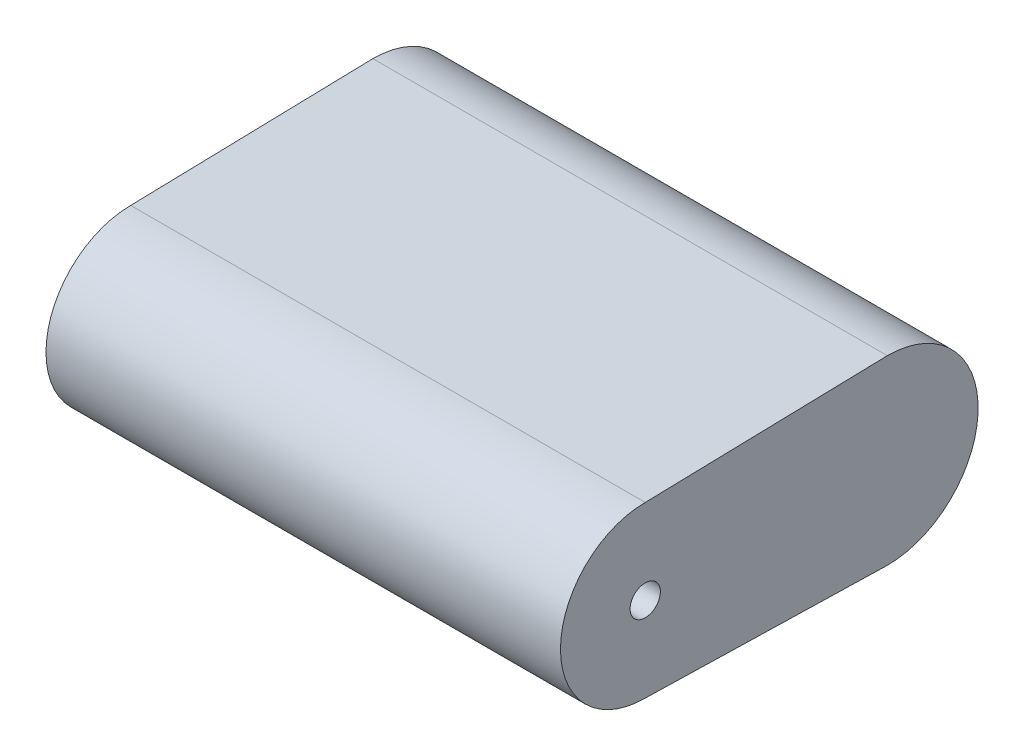
ISO-10303-21;
HEADER;
FILE_DESCRIPTION(('STEP AP214'),'2;1');
FILE_NAME('part.step','',(''),(''),'','','');
FILE_SCHEMA(('AUTOMOTIVE_DESIGN { 1 0 10303 214 1 1 1 1 }'));
ENDSEC;
DATA;
#1=APPLICATION_CONTEXT('core data for automotive mechanical design processes');
#2=APPLICATION_PROTOCOL_DEFINITION('international standard','automotive_design',2000,#1);
#3=PRODUCT_CONTEXT('',#1,'mechanical');
#4=PRODUCT('Part','Part','',(#3));
#5=PRODUCT_RELATED_PRODUCT_CATEGORY('part','',(#4));
#6=PRODUCT_DEFINITION_FORMATION('','',#4);
#7=PRODUCT_DEFINITION_CONTEXT('part definition',#1,'design');
#8=PRODUCT_DEFINITION('design','',#6,#7);
#9=PRODUCT_DEFINITION_SHAPE('','',#8);
#10=(LENGTH_UNIT() NAMED_UNIT(*) SI_UNIT(.MILLI.,.METRE.));
#11=(NAMED_UNIT(*) PLANE_ANGLE_UNIT() SI_UNIT($,.RADIAN.));
#12=(NAMED_UNIT(*) SI_UNIT($,.STERADIAN.) SOLID_ANGLE_UNIT());
#13=UNCERTAINTY_MEASURE_WITH_UNIT(LENGTH_MEASURE(1.E-05),#10,'distance_accuracy_value','');
#14=(GEOMETRIC_REPRESENTATION_CONTEXT(3) GLOBAL_UNCERTAINTY_ASSIGNED_CONTEXT((#13)) GLOBAL_UNIT_ASSIGNED_CONTEXT((#10,
#11,#12)) REPRESENTATION_CONTEXT('',''));
#15=CARTESIAN_POINT('',(0.,0.,0.));
#16=DIRECTION('',(0.,0.,1.));
#17=DIRECTION('',(1.,0.,0.));
#18=AXIS2_PLACEMENT_3D('',#15,#16,#17);
#19=CARTESIAN_POINT('',(42.5,0.,0.));
#20=DIRECTION('',(1.,0.,0.));
#21=DIRECTION('',(0.,0.,-1.));
#22=AXIS2_PLACEMENT_3D('',#19,#20,#21);
#23=PLANE('',#22);
#24=CARTESIAN_POINT('',(42.5,0.,0.));
#25=DIRECTION('',(1.,0.,0.));
#26=DIRECTION('',(0.,0.,-1.));
#27=AXIS2_PLACEMENT_3D('',#24,#25,#26);
#28=CIRCLE('',#27,14.);
#29=CARTESIAN_POINT('',(42.5,14.,0.));
#30=VERTEX_POINT('',#29);
#31=CARTESIAN_POINT('',(42.5,-14.,0.));
#32=VERTEX_POINT('',#31);
#33=EDGE_CURVE('E85',#30,#32,#28,.T.);
#34=ORIENTED_EDGE('',*,*,#33,.T.);
#35=DIRECTION('',(0.,-0.024992191160203,-0.999687646408123));
#36=VECTOR('',#35,1.);
#37=CARTESIAN_POINT('',(42.5,-14.,0.));
#38=LINE('',#37,#36);
#39=CARTESIAN_POINT('',(42.5,-15.,-40.));
#40=VERTEX_POINT('',#39);
#41=EDGE_CURVE('E80',#32,#40,#38,.T.);
#42=ORIENTED_EDGE('',*,*,#41,.T.);
#43=CARTESIAN_POINT('',(42.5,0.,-40.));
#44=DIRECTION('',(1.,0.,0.));
#45=DIRECTION('',(0.,0.,-1.));
#46=AXIS2_PLACEMENT_3D('',#43,#44,#45);
#47=CIRCLE('',#46,15.);
#48=CARTESIAN_POINT('',(42.5,15.,-40.));
#49=VERTEX_POINT('',#48);
#50=EDGE_CURVE('E83',#40,#49,#47,.T.);
#51=ORIENTED_EDGE('',*,*,#50,.T.);
#52=DIRECTION('',(0.,-0.024992191160203,0.999687646408123));
#53=VECTOR('',#52,1.);
#54=CARTESIAN_POINT('',(42.5,14.,0.));
#55=LINE('',#54,#53);
#56=EDGE_CURVE('E50',#49,#30,#55,.T.);
#57=ORIENTED_EDGE('',*,*,#56,.T.);
#58=EDGE_LOOP('',(#34,#42,#51,#57));
#59=FACE_BOUND('',#58,.T.);
#60=CARTESIAN_POINT('',(42.5,0.,0.));
#61=DIRECTION('',(1.,0.,0.));
#62=DIRECTION('',(0.,0.,-1.));
#63=AXIS2_PLACEMENT_3D('',#60,#61,#62);
#64=CIRCLE('',#63,2.5);
#65=CARTESIAN_POINT('',(42.5,0.,-2.5));
#66=VERTEX_POINT('',#65);
#67=EDGE_CURVE('E100',#66,#66,#64,.T.);
#68=ORIENTED_EDGE('',*,*,#67,.F.);
#69=EDGE_LOOP('',(#68));
#70=FACE_BOUND('',#69,.T.);
#71=ADVANCED_FACE('F33',(#59,#70),#23,.T.);
#72=CARTESIAN_POINT('',(-42.5,0.,0.));
#73=DIRECTION('',(1.,0.,0.));
#74=DIRECTION('',(0.,0.,-1.));
#75=AXIS2_PLACEMENT_3D('',#72,#73,#74);
#76=PLANE('',#75);
#77=CARTESIAN_POINT('',(-42.5,0.,0.));
#78=DIRECTION('',(1.,0.,0.));
#79=DIRECTION('',(0.,0.,-1.));
#80=AXIS2_PLACEMENT_3D('',#77,#78,#79);
#81=CIRCLE('',#80,14.);
#82=CARTESIAN_POINT('',(-42.5,14.,0.));
#83=VERTEX_POINT('',#82);
#84=CARTESIAN_POINT('',(-42.5,-14.,0.));
#85=VERTEX_POINT('',#84);
#86=EDGE_CURVE('E97',#83,#85,#81,.T.);
#87=ORIENTED_EDGE('',*,*,#86,.F.);
#88=DIRECTION('',(0.,-0.024992191160203,0.999687646408123));
#89=VECTOR('',#88,1.);
#90=CARTESIAN_POINT('',(-42.5,14.,0.));
#91=LINE('',#90,#89);
#92=CARTESIAN_POINT('',(-42.5,15.,-40.));
#93=VERTEX_POINT('',#92);
#94=EDGE_CURVE('E73',#93,#83,#91,.T.);
#95=ORIENTED_EDGE('',*,*,#94,.F.);
#96=CARTESIAN_POINT('',(-42.5,0.,-40.));
#97=DIRECTION('',(1.,0.,0.));
#98=DIRECTION('',(0.,0.,-1.));
#99=AXIS2_PLACEMENT_3D('',#96,#97,#98);
#100=CIRCLE('',#99,15.);
#101=CARTESIAN_POINT('',(-42.5,-15.,-40.));
#102=VERTEX_POINT('',#101);
#103=EDGE_CURVE('E67',#102,#93,#100,.T.);
#104=ORIENTED_EDGE('',*,*,#103,.F.);
#105=DIRECTION('',(0.,-0.024992191160203,-0.999687646408123));
#106=VECTOR('',#105,1.);
#107=CARTESIAN_POINT('',(-42.5,-14.,0.));
#108=LINE('',#107,#106);
#109=EDGE_CURVE('E89',#85,#102,#108,.T.);
#110=ORIENTED_EDGE('',*,*,#109,.F.);
#111=EDGE_LOOP('',(#87,#95,#104,#110));
#112=FACE_BOUND('',#111,.T.);
#113=CARTESIAN_POINT('',(-42.5,0.,0.));
#114=DIRECTION('',(1.,0.,0.));
#115=DIRECTION('',(0.,0.,-1.));
#116=AXIS2_PLACEMENT_3D('',#113,#114,#115);
#117=CIRCLE('',#116,2.5);
#118=CARTESIAN_POINT('',(-42.5,0.,-2.5));
#119=VERTEX_POINT('',#118);
#120=EDGE_CURVE('E112',#119,#119,#117,.T.);
#121=ORIENTED_EDGE('',*,*,#120,.T.);
#122=EDGE_LOOP('',(#121));
#123=FACE_BOUND('',#122,.T.);
#124=ADVANCED_FACE('F108',(#112,#123),#76,.F.);
#125=CARTESIAN_POINT('',(42.5,0.,0.));
#126=DIRECTION('',(-1.,0.,0.));
#127=DIRECTION('',(0.,0.,1.));
#128=AXIS2_PLACEMENT_3D('',#125,#126,#127);
#129=CYLINDRICAL_SURFACE('',#128,14.);
#130=ORIENTED_EDGE('',*,*,#86,.T.);
#131=DIRECTION('',(-1.,0.,0.));
#132=VECTOR('',#131,1.);
#133=CARTESIAN_POINT('',(42.5,-14.,0.));
#134=LINE('',#133,#132);
#135=EDGE_CURVE('E11',#32,#85,#134,.T.);
#136=ORIENTED_EDGE('',*,*,#135,.F.);
#137=ORIENTED_EDGE('',*,*,#33,.F.);
#138=DIRECTION('',(-1.,0.,0.));
#139=VECTOR('',#138,1.);
#140=CARTESIAN_POINT('',(42.5,14.,0.));
#141=LINE('',#140,#139);
#142=EDGE_CURVE('E93',#30,#83,#141,.T.);
#143=ORIENTED_EDGE('',*,*,#142,.T.);
#144=EDGE_LOOP('',(#130,#136,#137,#143));
#145=FACE_BOUND('',#144,.T.);
#146=ADVANCED_FACE('F35',(#145),#129,.T.);
#147=CARTESIAN_POINT('',(42.5,-14.,0.));
#148=DIRECTION('',(0.,0.999687646408123,-0.024992191160203));
#149=DIRECTION('',(0.,0.024992191160203,0.999687646408123));
#150=AXIS2_PLACEMENT_3D('',#147,#148,#149);
#151=PLANE('',#150);
#152=ORIENTED_EDGE('',*,*,#109,.T.);
#153=DIRECTION('',(-1.,0.,0.));
#154=VECTOR('',#153,1.);
#155=CARTESIAN_POINT('',(42.5,-15.,-40.));
#156=LINE('',#155,#154);
#157=EDGE_CURVE('E42',#40,#102,#156,.T.);
#158=ORIENTED_EDGE('',*,*,#157,.F.);
#159=ORIENTED_EDGE('',*,*,#41,.F.);
#160=ORIENTED_EDGE('',*,*,#135,.T.);
#161=EDGE_LOOP('',(#152,#158,#159,#160));
#162=FACE_BOUND('',#161,.T.);
#163=ADVANCED_FACE('F88',(#162),#151,.F.);
#164=CARTESIAN_POINT('',(42.5,0.,-40.));
#165=DIRECTION('',(-1.,0.,0.));
#166=DIRECTION('',(0.,0.,1.));
#167=AXIS2_PLACEMENT_3D('',#164,#165,#166);
#168=CYLINDRICAL_SURFACE('',#167,15.);
#169=ORIENTED_EDGE('',*,*,#103,.T.);
#170=DIRECTION('',(-1.,0.,0.));
#171=VECTOR('',#170,1.);
#172=CARTESIAN_POINT('',(42.5,15.,-40.));
#173=LINE('',#172,#171);
#174=EDGE_CURVE('E90',#49,#93,#173,.T.);
#175=ORIENTED_EDGE('',*,*,#174,.F.);
#176=ORIENTED_EDGE('',*,*,#50,.F.);
#177=ORIENTED_EDGE('',*,*,#157,.T.);
#178=EDGE_LOOP('',(#169,#175,#176,#177));
#179=FACE_BOUND('',#178,.T.);
#180=ADVANCED_FACE('F91',(#179),#168,.T.);
#181=CARTESIAN_POINT('',(42.5,14.,0.));
#182=DIRECTION('',(0.,-0.999687646408123,-0.024992191160203));
#183=DIRECTION('',(0.,0.024992191160203,-0.999687646408123));
#184=AXIS2_PLACEMENT_3D('',#181,#182,#183);
#185=PLANE('',#184);
#186=ORIENTED_EDGE('',*,*,#94,.T.);
#187=ORIENTED_EDGE('',*,*,#142,.F.);
#188=ORIENTED_EDGE('',*,*,#56,.F.);
#189=ORIENTED_EDGE('',*,*,#174,.T.);
#190=EDGE_LOOP('',(#186,#187,#188,#189));
#191=FACE_BOUND('',#190,.T.);
#192=ADVANCED_FACE('F105',(#191),#185,.F.);
#193=CARTESIAN_POINT('',(42.5,0.,0.));
#194=DIRECTION('',(-1.,0.,0.));
#195=DIRECTION('',(0.,0.,1.));
#196=AXIS2_PLACEMENT_3D('',#193,#194,#195);
#197=CYLINDRICAL_SURFACE('',#196,2.5);
#198=ORIENTED_EDGE('',*,*,#67,.T.);
#199=EDGE_LOOP('',(#198));
#200=FACE_BOUND('',#199,.T.);
#201=ORIENTED_EDGE('',*,*,#120,.F.);
#202=EDGE_LOOP('',(#201));
#203=FACE_BOUND('',#202,.T.);
#204=ADVANCED_FACE('F118',(#200,#203),#197,.F.);
#205=CLOSED_SHELL('',(#71,#124,#146,#163,#180,#192,#204));
#206=MANIFOLD_SOLID_BREP('B2',#205);
#207=ADVANCED_BREP_SHAPE_REPRESENTATION('',(#18,#206),#14);
#208=SHAPE_DEFINITION_REPRESENTATION(#9,#207);
ENDSEC;
END-ISO-10303-21;
